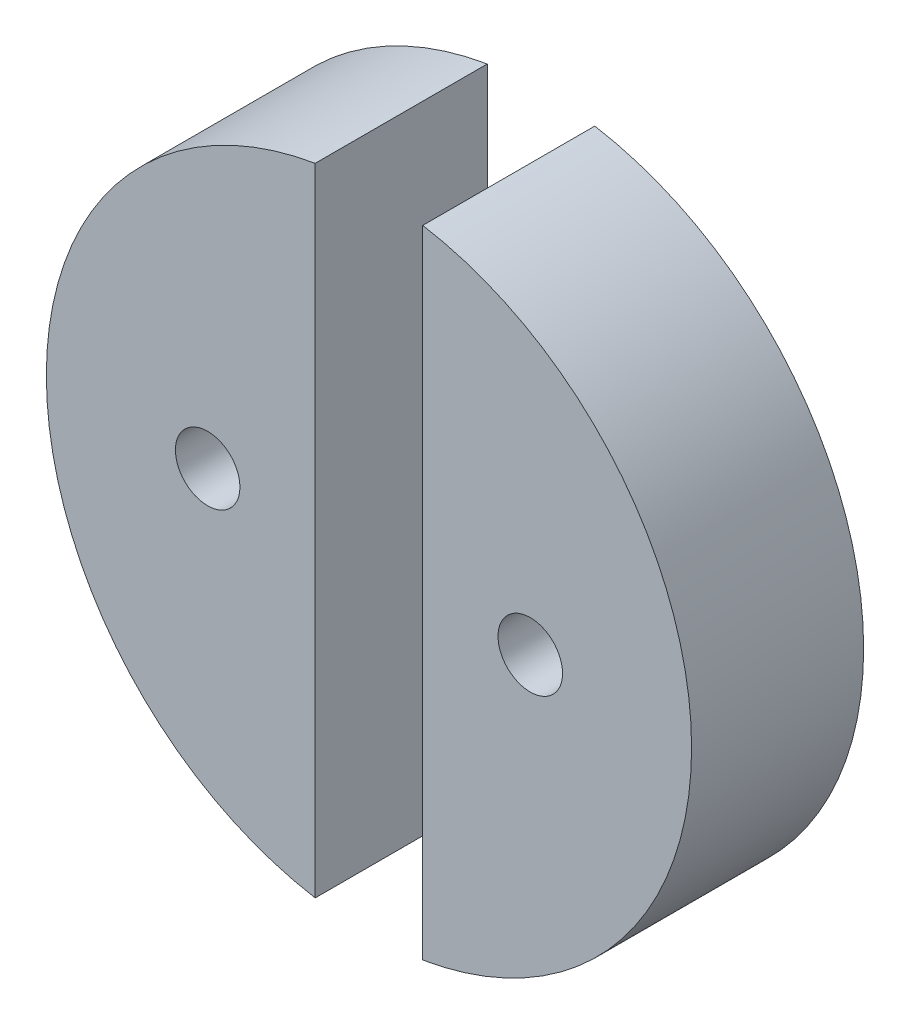
ISO-10303-21;
HEADER;
FILE_DESCRIPTION(('STEP AP214'),'2;1');
FILE_NAME('part.step','',(''),(''),'','','');
FILE_SCHEMA(('AUTOMOTIVE_DESIGN { 1 0 10303 214 1 1 1 1 }'));
ENDSEC;
DATA;
#1=APPLICATION_CONTEXT('core data for automotive mechanical design processes');
#2=APPLICATION_PROTOCOL_DEFINITION('international standard','automotive_design',2000,#1);
#3=PRODUCT_CONTEXT('',#1,'mechanical');
#4=PRODUCT('Part','Part','',(#3));
#5=PRODUCT_RELATED_PRODUCT_CATEGORY('part','',(#4));
#6=PRODUCT_DEFINITION_FORMATION('','',#4);
#7=PRODUCT_DEFINITION_CONTEXT('part definition',#1,'design');
#8=PRODUCT_DEFINITION('design','',#6,#7);
#9=PRODUCT_DEFINITION_SHAPE('','',#8);
#10=(LENGTH_UNIT() NAMED_UNIT(*) SI_UNIT(.MILLI.,.METRE.));
#11=(NAMED_UNIT(*) PLANE_ANGLE_UNIT() SI_UNIT($,.RADIAN.));
#12=(NAMED_UNIT(*) SI_UNIT($,.STERADIAN.) SOLID_ANGLE_UNIT());
#13=UNCERTAINTY_MEASURE_WITH_UNIT(LENGTH_MEASURE(1.E-05),#10,'distance_accuracy_value','');
#14=(GEOMETRIC_REPRESENTATION_CONTEXT(3) GLOBAL_UNCERTAINTY_ASSIGNED_CONTEXT((#13)) GLOBAL_UNIT_ASSIGNED_CONTEXT((#10,
#11,#12)) REPRESENTATION_CONTEXT('',''));
#15=CARTESIAN_POINT('',(0.,0.,0.));
#16=DIRECTION('',(0.,0.,1.));
#17=DIRECTION('',(1.,0.,0.));
#18=AXIS2_PLACEMENT_3D('',#15,#16,#17);
#19=CARTESIAN_POINT('',(0.,0.,8.));
#20=DIRECTION('',(0.,0.,1.));
#21=DIRECTION('',(1.,0.,0.));
#22=AXIS2_PLACEMENT_3D('',#19,#20,#21);
#23=PLANE('',#22);
#24=DIRECTION('',(0.,1.,0.));
#25=VECTOR('',#24,1.);
#26=CARTESIAN_POINT('',(-2.5,0.,8.));
#27=LINE('',#26,#25);
#28=CARTESIAN_POINT('',(-2.5,-14.790199457749,8.));
#29=VERTEX_POINT('',#28);
#30=CARTESIAN_POINT('',(-2.5,14.790199457749,8.));
#31=VERTEX_POINT('',#30);
#32=EDGE_CURVE('E60',#29,#31,#27,.T.);
#33=ORIENTED_EDGE('',*,*,#32,.T.);
#34=CARTESIAN_POINT('',(0.,0.,8.));
#35=DIRECTION('',(0.,0.,1.));
#36=DIRECTION('',(1.,0.,0.));
#37=AXIS2_PLACEMENT_3D('',#34,#35,#36);
#38=CIRCLE('',#37,15.);
#39=EDGE_CURVE('E77',#31,#29,#38,.T.);
#40=ORIENTED_EDGE('',*,*,#39,.T.);
#41=EDGE_LOOP('',(#33,#40));
#42=FACE_BOUND('',#41,.T.);
#43=CARTESIAN_POINT('',(-7.5,0.,8.));
#44=DIRECTION('',(0.,0.,1.));
#45=DIRECTION('',(1.,0.,0.));
#46=AXIS2_PLACEMENT_3D('',#43,#44,#45);
#47=CIRCLE('',#46,1.5);
#48=CARTESIAN_POINT('',(-6.,0.,8.));
#49=VERTEX_POINT('',#48);
#50=EDGE_CURVE('E74',#49,#49,#47,.T.);
#51=ORIENTED_EDGE('',*,*,#50,.F.);
#52=EDGE_LOOP('',(#51));
#53=FACE_BOUND('',#52,.T.);
#54=ADVANCED_FACE('F43',(#42,#53),#23,.T.);
#55=CARTESIAN_POINT('',(0.,0.,0.));
#56=DIRECTION('',(0.,0.,1.));
#57=DIRECTION('',(1.,0.,0.));
#58=AXIS2_PLACEMENT_3D('',#55,#56,#57);
#59=PLANE('',#58);
#60=CARTESIAN_POINT('',(0.,0.,0.));
#61=DIRECTION('',(0.,0.,1.));
#62=DIRECTION('',(1.,0.,0.));
#63=AXIS2_PLACEMENT_3D('',#60,#61,#62);
#64=CIRCLE('',#63,15.);
#65=CARTESIAN_POINT('',(-2.5,14.790199457749,0.));
#66=VERTEX_POINT('',#65);
#67=CARTESIAN_POINT('',(-2.5,-14.790199457749,0.));
#68=VERTEX_POINT('',#67);
#69=EDGE_CURVE('E72',#66,#68,#64,.T.);
#70=ORIENTED_EDGE('',*,*,#69,.F.);
#71=DIRECTION('',(0.,1.,0.));
#72=VECTOR('',#71,1.);
#73=CARTESIAN_POINT('',(-2.5,0.,0.));
#74=LINE('',#73,#72);
#75=EDGE_CURVE('E67',#68,#66,#74,.T.);
#76=ORIENTED_EDGE('',*,*,#75,.F.);
#77=EDGE_LOOP('',(#70,#76));
#78=FACE_BOUND('',#77,.T.);
#79=CARTESIAN_POINT('',(-7.5,0.,0.));
#80=DIRECTION('',(0.,0.,1.));
#81=DIRECTION('',(1.,0.,0.));
#82=AXIS2_PLACEMENT_3D('',#79,#80,#81);
#83=CIRCLE('',#82,1.5);
#84=CARTESIAN_POINT('',(-6.,0.,0.));
#85=VERTEX_POINT('',#84);
#86=EDGE_CURVE('E84',#85,#85,#83,.T.);
#87=ORIENTED_EDGE('',*,*,#86,.T.);
#88=EDGE_LOOP('',(#87));
#89=FACE_BOUND('',#88,.T.);
#90=ADVANCED_FACE('F78',(#78,#89),#59,.F.);
#91=CARTESIAN_POINT('',(0.,0.,8.));
#92=DIRECTION('',(0.,0.,-1.));
#93=DIRECTION('',(-1.,0.,0.));
#94=AXIS2_PLACEMENT_3D('',#91,#92,#93);
#95=CYLINDRICAL_SURFACE('',#94,15.);
#96=ORIENTED_EDGE('',*,*,#69,.T.);
#97=DIRECTION('',(0.,0.,-1.));
#98=VECTOR('',#97,1.);
#99=CARTESIAN_POINT('',(-2.5,-14.790199457749,8.));
#100=LINE('',#99,#98);
#101=EDGE_CURVE('E52',#29,#68,#100,.T.);
#102=ORIENTED_EDGE('',*,*,#101,.F.);
#103=ORIENTED_EDGE('',*,*,#39,.F.);
#104=DIRECTION('',(0.,0.,-1.));
#105=VECTOR('',#104,1.);
#106=CARTESIAN_POINT('',(-2.5,14.790199457749,8.));
#107=LINE('',#106,#105);
#108=EDGE_CURVE('E12',#31,#66,#107,.T.);
#109=ORIENTED_EDGE('',*,*,#108,.T.);
#110=EDGE_LOOP('',(#96,#102,#103,#109));
#111=FACE_BOUND('',#110,.T.);
#112=ADVANCED_FACE('F45',(#111),#95,.T.);
#113=CARTESIAN_POINT('',(-2.5,0.,8.));
#114=DIRECTION('',(-1.,0.,0.));
#115=DIRECTION('',(0.,0.,1.));
#116=AXIS2_PLACEMENT_3D('',#113,#114,#115);
#117=PLANE('',#116);
#118=ORIENTED_EDGE('',*,*,#75,.T.);
#119=ORIENTED_EDGE('',*,*,#108,.F.);
#120=ORIENTED_EDGE('',*,*,#32,.F.);
#121=ORIENTED_EDGE('',*,*,#101,.T.);
#122=EDGE_LOOP('',(#118,#119,#120,#121));
#123=FACE_BOUND('',#122,.T.);
#124=ADVANCED_FACE('F76',(#123),#117,.F.);
#125=CARTESIAN_POINT('',(-7.5,0.,8.));
#126=DIRECTION('',(0.,0.,-1.));
#127=DIRECTION('',(-1.,0.,0.));
#128=AXIS2_PLACEMENT_3D('',#125,#126,#127);
#129=CYLINDRICAL_SURFACE('',#128,1.5);
#130=ORIENTED_EDGE('',*,*,#50,.T.);
#131=EDGE_LOOP('',(#130));
#132=FACE_BOUND('',#131,.T.);
#133=ORIENTED_EDGE('',*,*,#86,.F.);
#134=EDGE_LOOP('',(#133));
#135=FACE_BOUND('',#134,.T.);
#136=ADVANCED_FACE('F90',(#132,#135),#129,.F.);
#137=CLOSED_SHELL('',(#54,#90,#112,#124,#136));
#138=MANIFOLD_SOLID_BREP('B2',#137);
#139=CARTESIAN_POINT('',(0.,0.,8.));
#140=DIRECTION('',(0.,0.,1.));
#141=DIRECTION('',(1.,0.,0.));
#142=AXIS2_PLACEMENT_3D('',#139,#140,#141);
#143=PLANE('',#142);
#144=DIRECTION('',(0.,-1.,0.));
#145=VECTOR('',#144,1.);
#146=CARTESIAN_POINT('',(2.5,0.,8.));
#147=LINE('',#146,#145);
#148=CARTESIAN_POINT('',(2.50000000000001,14.790199457749,8.));
#149=VERTEX_POINT('',#148);
#150=CARTESIAN_POINT('',(2.5,-14.790199457749,8.));
#151=VERTEX_POINT('',#150);
#152=EDGE_CURVE('E176',#149,#151,#147,.T.);
#153=ORIENTED_EDGE('',*,*,#152,.T.);
#154=CARTESIAN_POINT('',(0.,0.,8.));
#155=DIRECTION('',(0.,0.,1.));
#156=DIRECTION('',(1.,0.,0.));
#157=AXIS2_PLACEMENT_3D('',#154,#155,#156);
#158=CIRCLE('',#157,15.);
#159=EDGE_CURVE('E155',#151,#149,#158,.T.);
#160=ORIENTED_EDGE('',*,*,#159,.T.);
#161=EDGE_LOOP('',(#153,#160));
#162=FACE_BOUND('',#161,.T.);
#163=CARTESIAN_POINT('',(7.5,0.,8.));
#164=DIRECTION('',(0.,0.,1.));
#165=DIRECTION('',(1.,0.,0.));
#166=AXIS2_PLACEMENT_3D('',#163,#164,#165);
#167=CIRCLE('',#166,1.5);
#168=CARTESIAN_POINT('',(9.,0.,8.));
#169=VERTEX_POINT('',#168);
#170=EDGE_CURVE('E171',#169,#169,#167,.T.);
#171=ORIENTED_EDGE('',*,*,#170,.F.);
#172=EDGE_LOOP('',(#171));
#173=FACE_BOUND('',#172,.T.);
#174=ADVANCED_FACE('F139',(#162,#173),#143,.T.);
#175=CARTESIAN_POINT('',(0.,0.,0.));
#176=DIRECTION('',(0.,0.,1.));
#177=DIRECTION('',(1.,0.,0.));
#178=AXIS2_PLACEMENT_3D('',#175,#176,#177);
#179=PLANE('',#178);
#180=DIRECTION('',(0.,-1.,0.));
#181=VECTOR('',#180,1.);
#182=CARTESIAN_POINT('',(2.5,0.,0.));
#183=LINE('',#182,#181);
#184=CARTESIAN_POINT('',(2.50000000000001,14.790199457749,0.));
#185=VERTEX_POINT('',#184);
#186=CARTESIAN_POINT('',(2.5,-14.790199457749,0.));
#187=VERTEX_POINT('',#186);
#188=EDGE_CURVE('E164',#185,#187,#183,.T.);
#189=ORIENTED_EDGE('',*,*,#188,.F.);
#190=CARTESIAN_POINT('',(0.,0.,0.));
#191=DIRECTION('',(0.,0.,1.));
#192=DIRECTION('',(1.,0.,0.));
#193=AXIS2_PLACEMENT_3D('',#190,#191,#192);
#194=CIRCLE('',#193,15.);
#195=EDGE_CURVE('E170',#187,#185,#194,.T.);
#196=ORIENTED_EDGE('',*,*,#195,.F.);
#197=EDGE_LOOP('',(#189,#196));
#198=FACE_BOUND('',#197,.T.);
#199=CARTESIAN_POINT('',(7.5,0.,0.));
#200=DIRECTION('',(0.,0.,1.));
#201=DIRECTION('',(1.,0.,0.));
#202=AXIS2_PLACEMENT_3D('',#199,#200,#201);
#203=CIRCLE('',#202,1.5);
#204=CARTESIAN_POINT('',(9.,0.,0.));
#205=VERTEX_POINT('',#204);
#206=EDGE_CURVE('E181',#205,#205,#203,.T.);
#207=ORIENTED_EDGE('',*,*,#206,.T.);
#208=EDGE_LOOP('',(#207));
#209=FACE_BOUND('',#208,.T.);
#210=ADVANCED_FACE('F168',(#198,#209),#179,.F.);
#211=CARTESIAN_POINT('',(2.5,0.,8.));
#212=DIRECTION('',(1.,0.,0.));
#213=DIRECTION('',(0.,0.,-1.));
#214=AXIS2_PLACEMENT_3D('',#211,#212,#213);
#215=PLANE('',#214);
#216=ORIENTED_EDGE('',*,*,#188,.T.);
#217=DIRECTION('',(0.,0.,-1.));
#218=VECTOR('',#217,1.);
#219=CARTESIAN_POINT('',(2.5,-14.790199457749,8.));
#220=LINE('',#219,#218);
#221=EDGE_CURVE('E41',#151,#187,#220,.T.);
#222=ORIENTED_EDGE('',*,*,#221,.F.);
#223=ORIENTED_EDGE('',*,*,#152,.F.);
#224=DIRECTION('',(0.,0.,-1.));
#225=VECTOR('',#224,1.);
#226=CARTESIAN_POINT('',(2.50000000000001,14.790199457749,8.));
#227=LINE('',#226,#225);
#228=EDGE_CURVE('E148',#149,#185,#227,.T.);
#229=ORIENTED_EDGE('',*,*,#228,.T.);
#230=EDGE_LOOP('',(#216,#222,#223,#229));
#231=FACE_BOUND('',#230,.T.);
#232=ADVANCED_FACE('F141',(#231),#215,.F.);
#233=CARTESIAN_POINT('',(0.,0.,8.));
#234=DIRECTION('',(0.,0.,-1.));
#235=DIRECTION('',(-1.,0.,0.));
#236=AXIS2_PLACEMENT_3D('',#233,#234,#235);
#237=CYLINDRICAL_SURFACE('',#236,15.);
#238=ORIENTED_EDGE('',*,*,#195,.T.);
#239=ORIENTED_EDGE('',*,*,#228,.F.);
#240=ORIENTED_EDGE('',*,*,#159,.F.);
#241=ORIENTED_EDGE('',*,*,#221,.T.);
#242=EDGE_LOOP('',(#238,#239,#240,#241));
#243=FACE_BOUND('',#242,.T.);
#244=ADVANCED_FACE('F174',(#243),#237,.T.);
#245=CARTESIAN_POINT('',(7.5,0.,8.));
#246=DIRECTION('',(0.,0.,-1.));
#247=DIRECTION('',(-1.,0.,0.));
#248=AXIS2_PLACEMENT_3D('',#245,#246,#247);
#249=CYLINDRICAL_SURFACE('',#248,1.5);
#250=ORIENTED_EDGE('',*,*,#170,.T.);
#251=EDGE_LOOP('',(#250));
#252=FACE_BOUND('',#251,.T.);
#253=ORIENTED_EDGE('',*,*,#206,.F.);
#254=EDGE_LOOP('',(#253));
#255=FACE_BOUND('',#254,.T.);
#256=ADVANCED_FACE('F187',(#252,#255),#249,.F.);
#257=CLOSED_SHELL('',(#174,#210,#232,#244,#256));
#258=MANIFOLD_SOLID_BREP('B6',#257);
#259=ADVANCED_BREP_SHAPE_REPRESENTATION('',(#18,#138,#258),#14);
#260=SHAPE_DEFINITION_REPRESENTATION(#9,#259);
ENDSEC;
END-ISO-10303-21;
